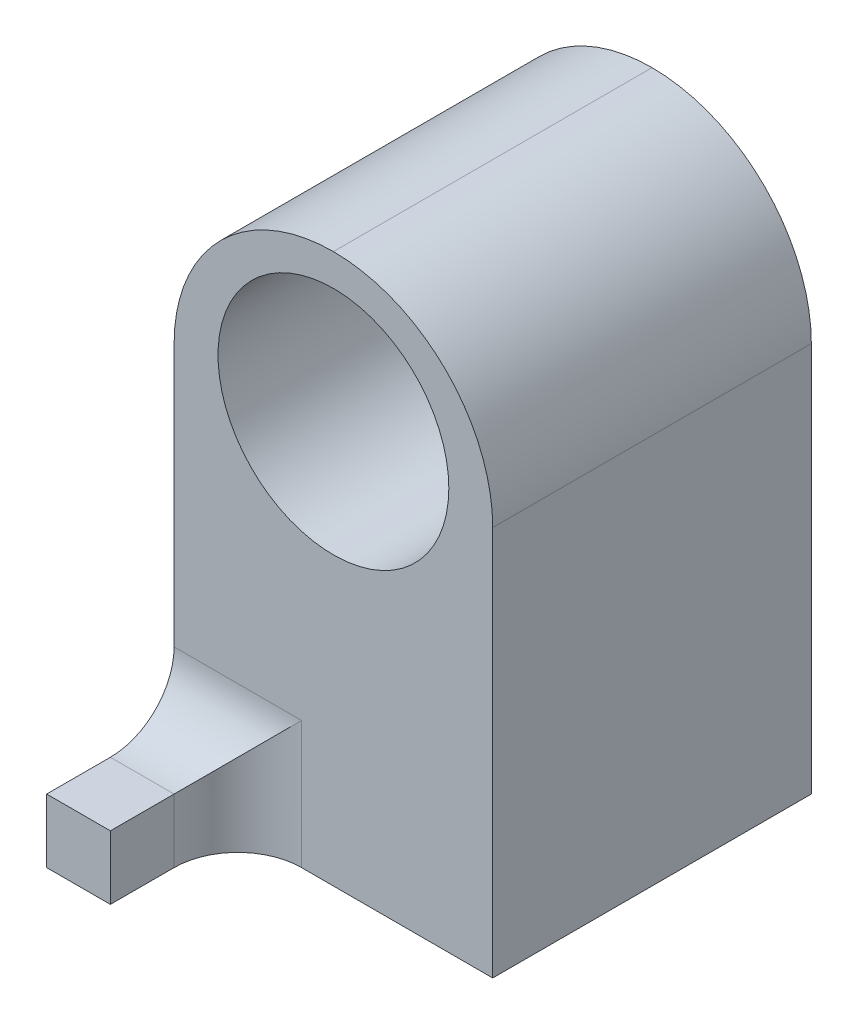
ISO-10303-21;
HEADER;
FILE_DESCRIPTION(('STEP AP214'),'2;1');
FILE_NAME('part.step','',(''),(''),'','','');
FILE_SCHEMA(('AUTOMOTIVE_DESIGN { 1 0 10303 214 1 1 1 1 }'));
ENDSEC;
DATA;
#1=APPLICATION_CONTEXT('core data for automotive mechanical design processes');
#2=APPLICATION_PROTOCOL_DEFINITION('international standard','automotive_design',2000,#1);
#3=PRODUCT_CONTEXT('',#1,'mechanical');
#4=PRODUCT('Part','Part','',(#3));
#5=PRODUCT_RELATED_PRODUCT_CATEGORY('part','',(#4));
#6=PRODUCT_DEFINITION_FORMATION('','',#4);
#7=PRODUCT_DEFINITION_CONTEXT('part definition',#1,'design');
#8=PRODUCT_DEFINITION('design','',#6,#7);
#9=PRODUCT_DEFINITION_SHAPE('','',#8);
#10=(LENGTH_UNIT() NAMED_UNIT(*) SI_UNIT(.MILLI.,.METRE.));
#11=(NAMED_UNIT(*) PLANE_ANGLE_UNIT() SI_UNIT($,.RADIAN.));
#12=(NAMED_UNIT(*) SI_UNIT($,.STERADIAN.) SOLID_ANGLE_UNIT());
#13=UNCERTAINTY_MEASURE_WITH_UNIT(LENGTH_MEASURE(1.E-05),#10,'distance_accuracy_value','');
#14=(GEOMETRIC_REPRESENTATION_CONTEXT(3) GLOBAL_UNCERTAINTY_ASSIGNED_CONTEXT((#13)) GLOBAL_UNIT_ASSIGNED_CONTEXT((#10,
#11,#12)) REPRESENTATION_CONTEXT('',''));
#15=CARTESIAN_POINT('',(0.,0.,0.));
#16=DIRECTION('',(0.,0.,1.));
#17=DIRECTION('',(1.,0.,0.));
#18=AXIS2_PLACEMENT_3D('',#15,#16,#17);
#19=CARTESIAN_POINT('',(-6.35,50.8,6.35));
#20=DIRECTION('',(0.,0.,-1.));
#21=DIRECTION('',(-1.,0.,0.));
#22=AXIS2_PLACEMENT_3D('',#19,#20,#21);
#23=PLANE('',#22);
#24=CARTESIAN_POINT('',(25.4,80.1497,6.35));
#25=DIRECTION('',(0.,0.,1.));
#26=DIRECTION('',(1.,0.,0.));
#27=AXIS2_PLACEMENT_3D('',#24,#25,#26);
#28=CIRCLE('',#27,22.9997);
#29=CARTESIAN_POINT('',(48.3997,80.1497,6.35));
#30=VERTEX_POINT('',#29);
#31=EDGE_CURVE('E193',#30,#30,#28,.T.);
#32=ORIENTED_EDGE('',*,*,#31,.F.);
#33=EDGE_LOOP('',(#32));
#34=FACE_BOUND('',#33,.T.);
#35=DIRECTION('',(0.,-1.,0.));
#36=VECTOR('',#35,1.);
#37=CARTESIAN_POINT('',(-6.35,50.8,6.35));
#38=LINE('',#37,#36);
#39=CARTESIAN_POINT('',(-6.35,77.7494,6.35));
#40=VERTEX_POINT('',#39);
#41=CARTESIAN_POINT('',(-6.35,25.4,6.35));
#42=VERTEX_POINT('',#41);
#43=EDGE_CURVE('E259',#40,#42,#38,.T.);
#44=ORIENTED_EDGE('',*,*,#43,.T.);
#45=DIRECTION('',(-1.,0.,0.));
#46=VECTOR('',#45,1.);
#47=CARTESIAN_POINT('',(6.35,25.4,6.35));
#48=LINE('',#47,#46);
#49=CARTESIAN_POINT('',(19.05,25.4,6.35));
#50=VERTEX_POINT('',#49);
#51=EDGE_CURVE('E62',#42,#50,#48,.F.);
#52=ORIENTED_EDGE('',*,*,#51,.T.);
#53=DIRECTION('',(0.,1.,0.));
#54=VECTOR('',#53,1.);
#55=CARTESIAN_POINT('',(19.05,0.,6.35));
#56=LINE('',#55,#54);
#57=CARTESIAN_POINT('',(19.05,0.,6.35));
#58=VERTEX_POINT('',#57);
#59=EDGE_CURVE('E287',#50,#58,#56,.F.);
#60=ORIENTED_EDGE('',*,*,#59,.T.);
#61=DIRECTION('',(1.,0.,0.));
#62=VECTOR('',#61,1.);
#63=CARTESIAN_POINT('',(-6.35,0.,6.35));
#64=LINE('',#63,#62);
#65=CARTESIAN_POINT('',(57.15,0.,6.35));
#66=VERTEX_POINT('',#65);
#67=EDGE_CURVE('E153',#58,#66,#64,.T.);
#68=ORIENTED_EDGE('',*,*,#67,.T.);
#69=DIRECTION('',(0.,-1.,0.));
#70=VECTOR('',#69,1.);
#71=CARTESIAN_POINT('',(57.15,50.8,6.35));
#72=LINE('',#71,#70);
#73=CARTESIAN_POINT('',(57.15,77.7494,6.35));
#74=VERTEX_POINT('',#73);
#75=EDGE_CURVE('E255',#74,#66,#72,.T.);
#76=ORIENTED_EDGE('',*,*,#75,.F.);
#77=CARTESIAN_POINT('',(25.4,77.7494,6.35));
#78=DIRECTION('',(0.,0.,-1.));
#79=DIRECTION('',(-1.,0.,0.));
#80=AXIS2_PLACEMENT_3D('',#77,#78,#79);
#81=CIRCLE('',#80,31.75);
#82=CARTESIAN_POINT('',(25.4,109.4994,6.35));
#83=VERTEX_POINT('',#82);
#84=EDGE_CURVE('E262',#74,#83,#81,.F.);
#85=ORIENTED_EDGE('',*,*,#84,.T.);
#86=CARTESIAN_POINT('',(25.4,77.7494,6.35));
#87=DIRECTION('',(0.,0.,-1.));
#88=DIRECTION('',(-1.,0.,0.));
#89=AXIS2_PLACEMENT_3D('',#86,#87,#88);
#90=CIRCLE('',#89,31.75);
#91=EDGE_CURVE('E265',#83,#40,#90,.F.);
#92=ORIENTED_EDGE('',*,*,#91,.T.);
#93=EDGE_LOOP('',(#44,#52,#60,#68,#76,#85,#92));
#94=FACE_BOUND('',#93,.T.);
#95=ADVANCED_FACE('F39',(#34,#94),#23,.F.);
#96=CARTESIAN_POINT('',(0.,0.,0.));
#97=DIRECTION('',(0.,-1.,0.));
#98=DIRECTION('',(0.,0.,-1.));
#99=AXIS2_PLACEMENT_3D('',#96,#97,#98);
#100=PLANE('',#99);
#101=DIRECTION('',(0.,0.,1.));
#102=VECTOR('',#101,1.);
#103=CARTESIAN_POINT('',(-6.35,0.,6.35));
#104=LINE('',#103,#102);
#105=CARTESIAN_POINT('',(-6.35,0.,-57.15));
#106=VERTEX_POINT('',#105);
#107=CARTESIAN_POINT('',(-6.35,0.,31.75));
#108=VERTEX_POINT('',#107);
#109=EDGE_CURVE('E140',#106,#108,#104,.T.);
#110=ORIENTED_EDGE('',*,*,#109,.F.);
#111=DIRECTION('',(-1.,0.,0.));
#112=VECTOR('',#111,1.);
#113=CARTESIAN_POINT('',(-6.35,0.,-57.15));
#114=LINE('',#113,#112);
#115=CARTESIAN_POINT('',(57.15,0.,-57.15));
#116=VERTEX_POINT('',#115);
#117=EDGE_CURVE('E247',#116,#106,#114,.T.);
#118=ORIENTED_EDGE('',*,*,#117,.F.);
#119=DIRECTION('',(0.,0.,-1.));
#120=VECTOR('',#119,1.);
#121=CARTESIAN_POINT('',(57.15,0.,6.35));
#122=LINE('',#121,#120);
#123=EDGE_CURVE('E243',#66,#116,#122,.T.);
#124=ORIENTED_EDGE('',*,*,#123,.F.);
#125=ORIENTED_EDGE('',*,*,#67,.F.);
#126=CARTESIAN_POINT('',(19.05,0.,19.05));
#127=DIRECTION('',(0.,-1.,0.));
#128=DIRECTION('',(0.,0.,-1.));
#129=AXIS2_PLACEMENT_3D('',#126,#127,#128);
#130=CIRCLE('',#129,12.7);
#131=CARTESIAN_POINT('',(6.35,0.,19.05));
#132=VERTEX_POINT('',#131);
#133=EDGE_CURVE('E11',#58,#132,#130,.F.);
#134=ORIENTED_EDGE('',*,*,#133,.T.);
#135=DIRECTION('',(0.,0.,-1.));
#136=VECTOR('',#135,1.);
#137=CARTESIAN_POINT('',(6.35,0.,31.75));
#138=LINE('',#137,#136);
#139=CARTESIAN_POINT('',(6.35,0.,31.75));
#140=VERTEX_POINT('',#139);
#141=EDGE_CURVE('E159',#140,#132,#138,.T.);
#142=ORIENTED_EDGE('',*,*,#141,.F.);
#143=DIRECTION('',(1.,0.,0.));
#144=VECTOR('',#143,1.);
#145=CARTESIAN_POINT('',(-6.35,0.,31.75));
#146=LINE('',#145,#144);
#147=EDGE_CURVE('E156',#108,#140,#146,.T.);
#148=ORIENTED_EDGE('',*,*,#147,.F.);
#149=EDGE_LOOP('',(#110,#118,#124,#125,#134,#142,#148));
#150=FACE_BOUND('',#149,.T.);
#151=DIRECTION('',(-1.,0.,0.));
#152=VECTOR('',#151,1.);
#153=CARTESIAN_POINT('',(0.,0.,-50.8));
#154=LINE('',#153,#152);
#155=CARTESIAN_POINT('',(50.8,0.,-50.8));
#156=VERTEX_POINT('',#155);
#157=CARTESIAN_POINT('',(0.,0.,-50.8));
#158=VERTEX_POINT('',#157);
#159=EDGE_CURVE('E202',#156,#158,#154,.T.);
#160=ORIENTED_EDGE('',*,*,#159,.T.);
#161=DIRECTION('',(0.,0.,1.));
#162=VECTOR('',#161,1.);
#163=CARTESIAN_POINT('',(0.,0.,0.));
#164=LINE('',#163,#162);
#165=CARTESIAN_POINT('',(0.,0.,0.));
#166=VERTEX_POINT('',#165);
#167=EDGE_CURVE('E192',#158,#166,#164,.T.);
#168=ORIENTED_EDGE('',*,*,#167,.T.);
#169=DIRECTION('',(1.,0.,0.));
#170=VECTOR('',#169,1.);
#171=CARTESIAN_POINT('',(0.,0.,0.));
#172=LINE('',#171,#170);
#173=CARTESIAN_POINT('',(50.8,0.,0.));
#174=VERTEX_POINT('',#173);
#175=EDGE_CURVE('E218',#166,#174,#172,.T.);
#176=ORIENTED_EDGE('',*,*,#175,.T.);
#177=DIRECTION('',(0.,0.,-1.));
#178=VECTOR('',#177,1.);
#179=CARTESIAN_POINT('',(50.8,0.,0.));
#180=LINE('',#179,#178);
#181=EDGE_CURVE('E222',#174,#156,#180,.T.);
#182=ORIENTED_EDGE('',*,*,#181,.T.);
#183=EDGE_LOOP('',(#160,#168,#176,#182));
#184=FACE_BOUND('',#183,.T.);
#185=ADVANCED_FACE('F157',(#150,#184),#100,.T.);
#186=CARTESIAN_POINT('',(-6.35,50.8,6.35));
#187=DIRECTION('',(1.,0.,0.));
#188=DIRECTION('',(0.,0.,-1.));
#189=AXIS2_PLACEMENT_3D('',#186,#187,#188);
#190=PLANE('',#189);
#191=ORIENTED_EDGE('',*,*,#43,.F.);
#192=DIRECTION('',(0.,0.,1.));
#193=VECTOR('',#192,1.);
#194=CARTESIAN_POINT('',(-6.35,77.7494,6.35));
#195=LINE('',#194,#193);
#196=CARTESIAN_POINT('',(-6.35,77.7494,-57.15));
#197=VERTEX_POINT('',#196);
#198=EDGE_CURVE('E268',#40,#197,#195,.F.);
#199=ORIENTED_EDGE('',*,*,#198,.T.);
#200=DIRECTION('',(0.,-1.,0.));
#201=VECTOR('',#200,1.);
#202=CARTESIAN_POINT('',(-6.35,50.8,-57.15));
#203=LINE('',#202,#201);
#204=EDGE_CURVE('E149',#197,#106,#203,.T.);
#205=ORIENTED_EDGE('',*,*,#204,.T.);
#206=ORIENTED_EDGE('',*,*,#109,.T.);
#207=DIRECTION('',(0.,-1.,0.));
#208=VECTOR('',#207,1.);
#209=CARTESIAN_POINT('',(-6.35,0.,31.75));
#210=LINE('',#209,#208);
#211=CARTESIAN_POINT('',(-6.35,12.7,31.75));
#212=VERTEX_POINT('',#211);
#213=EDGE_CURVE('E146',#212,#108,#210,.T.);
#214=ORIENTED_EDGE('',*,*,#213,.F.);
#215=DIRECTION('',(0.,0.,-1.));
#216=VECTOR('',#215,1.);
#217=CARTESIAN_POINT('',(-6.35,12.7,31.75));
#218=LINE('',#217,#216);
#219=CARTESIAN_POINT('',(-6.35,12.7,19.05));
#220=VERTEX_POINT('',#219);
#221=EDGE_CURVE('E178',#212,#220,#218,.T.);
#222=ORIENTED_EDGE('',*,*,#221,.T.);
#223=CARTESIAN_POINT('',(-6.35,25.4,19.05));
#224=DIRECTION('',(1.,0.,0.));
#225=DIRECTION('',(0.,0.,-1.));
#226=AXIS2_PLACEMENT_3D('',#223,#224,#225);
#227=CIRCLE('',#226,12.7);
#228=EDGE_CURVE('E49',#220,#42,#227,.T.);
#229=ORIENTED_EDGE('',*,*,#228,.T.);
#230=EDGE_LOOP('',(#191,#199,#205,#206,#214,#222,#229));
#231=FACE_BOUND('',#230,.T.);
#232=ADVANCED_FACE('F143',(#231),#190,.F.);
#233=CARTESIAN_POINT('',(57.15,50.8,6.35));
#234=DIRECTION('',(-1.,0.,0.));
#235=DIRECTION('',(0.,0.,1.));
#236=AXIS2_PLACEMENT_3D('',#233,#234,#235);
#237=PLANE('',#236);
#238=DIRECTION('',(0.,-1.,0.));
#239=VECTOR('',#238,1.);
#240=CARTESIAN_POINT('',(57.15,50.8,-57.15));
#241=LINE('',#240,#239);
#242=CARTESIAN_POINT('',(57.15,77.7494,-57.15));
#243=VERTEX_POINT('',#242);
#244=EDGE_CURVE('E252',#243,#116,#241,.T.);
#245=ORIENTED_EDGE('',*,*,#244,.F.);
#246=DIRECTION('',(0.,0.,-1.));
#247=VECTOR('',#246,1.);
#248=CARTESIAN_POINT('',(57.15,77.7494,6.35));
#249=LINE('',#248,#247);
#250=EDGE_CURVE('E277',#243,#74,#249,.F.);
#251=ORIENTED_EDGE('',*,*,#250,.T.);
#252=ORIENTED_EDGE('',*,*,#75,.T.);
#253=ORIENTED_EDGE('',*,*,#123,.T.);
#254=EDGE_LOOP('',(#245,#251,#252,#253));
#255=FACE_BOUND('',#254,.T.);
#256=ADVANCED_FACE('F308',(#255),#237,.F.);
#257=CARTESIAN_POINT('',(-6.35,50.8,-57.15));
#258=DIRECTION('',(0.,0.,1.));
#259=DIRECTION('',(1.,0.,0.));
#260=AXIS2_PLACEMENT_3D('',#257,#258,#259);
#261=PLANE('',#260);
#262=CARTESIAN_POINT('',(25.4,80.1497,-57.15));
#263=DIRECTION('',(0.,0.,1.));
#264=DIRECTION('',(1.,0.,0.));
#265=AXIS2_PLACEMENT_3D('',#262,#263,#264);
#266=CIRCLE('',#265,22.9997);
#267=CARTESIAN_POINT('',(48.3997,80.1497,-57.15));
#268=VERTEX_POINT('',#267);
#269=EDGE_CURVE('E188',#268,#268,#266,.T.);
#270=ORIENTED_EDGE('',*,*,#269,.T.);
#271=EDGE_LOOP('',(#270));
#272=FACE_BOUND('',#271,.T.);
#273=ORIENTED_EDGE('',*,*,#204,.F.);
#274=CARTESIAN_POINT('',(25.4,77.7494,-57.15));
#275=DIRECTION('',(0.,0.,1.));
#276=DIRECTION('',(1.,0.,0.));
#277=AXIS2_PLACEMENT_3D('',#274,#275,#276);
#278=CIRCLE('',#277,31.75);
#279=CARTESIAN_POINT('',(25.4,109.4994,-57.15));
#280=VERTEX_POINT('',#279);
#281=EDGE_CURVE('E274',#197,#280,#278,.F.);
#282=ORIENTED_EDGE('',*,*,#281,.T.);
#283=CARTESIAN_POINT('',(25.4,77.7494,-57.15));
#284=DIRECTION('',(0.,0.,1.));
#285=DIRECTION('',(1.,0.,0.));
#286=AXIS2_PLACEMENT_3D('',#283,#284,#285);
#287=CIRCLE('',#286,31.75);
#288=EDGE_CURVE('E271',#280,#243,#287,.F.);
#289=ORIENTED_EDGE('',*,*,#288,.T.);
#290=ORIENTED_EDGE('',*,*,#244,.T.);
#291=ORIENTED_EDGE('',*,*,#117,.T.);
#292=EDGE_LOOP('',(#273,#282,#289,#290,#291));
#293=FACE_BOUND('',#292,.T.);
#294=ADVANCED_FACE('F318',(#272,#293),#261,.F.);
#295=CARTESIAN_POINT('',(0.,50.8,0.));
#296=DIRECTION('',(1.,0.,0.));
#297=DIRECTION('',(0.,0.,-1.));
#298=AXIS2_PLACEMENT_3D('',#295,#296,#297);
#299=PLANE('',#298);
#300=ORIENTED_EDGE('',*,*,#167,.F.);
#301=DIRECTION('',(0.,-1.,0.));
#302=VECTOR('',#301,1.);
#303=CARTESIAN_POINT('',(0.,50.8,-50.8));
#304=LINE('',#303,#302);
#305=CARTESIAN_POINT('',(0.,50.8,-50.8));
#306=VERTEX_POINT('',#305);
#307=EDGE_CURVE('E214',#306,#158,#304,.T.);
#308=ORIENTED_EDGE('',*,*,#307,.F.);
#309=DIRECTION('',(0.,0.,1.));
#310=VECTOR('',#309,1.);
#311=CARTESIAN_POINT('',(0.,50.8,0.));
#312=LINE('',#311,#310);
#313=CARTESIAN_POINT('',(0.,50.8,0.));
#314=VERTEX_POINT('',#313);
#315=EDGE_CURVE('E197',#306,#314,#312,.T.);
#316=ORIENTED_EDGE('',*,*,#315,.T.);
#317=DIRECTION('',(0.,-1.,0.));
#318=VECTOR('',#317,1.);
#319=CARTESIAN_POINT('',(0.,50.8,0.));
#320=LINE('',#319,#318);
#321=EDGE_CURVE('E154',#314,#166,#320,.T.);
#322=ORIENTED_EDGE('',*,*,#321,.T.);
#323=EDGE_LOOP('',(#300,#308,#316,#322));
#324=FACE_BOUND('',#323,.T.);
#325=ADVANCED_FACE('F320',(#324),#299,.T.);
#326=CARTESIAN_POINT('',(0.,50.8,0.));
#327=DIRECTION('',(0.,0.,-1.));
#328=DIRECTION('',(-1.,0.,0.));
#329=AXIS2_PLACEMENT_3D('',#326,#327,#328);
#330=PLANE('',#329);
#331=ORIENTED_EDGE('',*,*,#175,.F.);
#332=ORIENTED_EDGE('',*,*,#321,.F.);
#333=DIRECTION('',(1.,0.,0.));
#334=VECTOR('',#333,1.);
#335=CARTESIAN_POINT('',(0.,50.8,0.));
#336=LINE('',#335,#334);
#337=CARTESIAN_POINT('',(50.8,50.8,0.));
#338=VERTEX_POINT('',#337);
#339=EDGE_CURVE('E201',#314,#338,#336,.T.);
#340=ORIENTED_EDGE('',*,*,#339,.T.);
#341=DIRECTION('',(0.,-1.,0.));
#342=VECTOR('',#341,1.);
#343=CARTESIAN_POINT('',(50.8,50.8,0.));
#344=LINE('',#343,#342);
#345=EDGE_CURVE('E235',#338,#174,#344,.T.);
#346=ORIENTED_EDGE('',*,*,#345,.T.);
#347=EDGE_LOOP('',(#331,#332,#340,#346));
#348=FACE_BOUND('',#347,.T.);
#349=ADVANCED_FACE('F327',(#348),#330,.T.);
#350=CARTESIAN_POINT('',(50.8,50.8,0.));
#351=DIRECTION('',(-1.,0.,0.));
#352=DIRECTION('',(0.,0.,1.));
#353=AXIS2_PLACEMENT_3D('',#350,#351,#352);
#354=PLANE('',#353);
#355=ORIENTED_EDGE('',*,*,#181,.F.);
#356=ORIENTED_EDGE('',*,*,#345,.F.);
#357=DIRECTION('',(0.,0.,-1.));
#358=VECTOR('',#357,1.);
#359=CARTESIAN_POINT('',(50.8,50.8,0.));
#360=LINE('',#359,#358);
#361=CARTESIAN_POINT('',(50.8,50.8,-50.8));
#362=VERTEX_POINT('',#361);
#363=EDGE_CURVE('E206',#338,#362,#360,.T.);
#364=ORIENTED_EDGE('',*,*,#363,.T.);
#365=DIRECTION('',(0.,-1.,0.));
#366=VECTOR('',#365,1.);
#367=CARTESIAN_POINT('',(50.8,50.8,-50.8));
#368=LINE('',#367,#366);
#369=EDGE_CURVE('E232',#362,#156,#368,.T.);
#370=ORIENTED_EDGE('',*,*,#369,.T.);
#371=EDGE_LOOP('',(#355,#356,#364,#370));
#372=FACE_BOUND('',#371,.T.);
#373=ADVANCED_FACE('F375',(#372),#354,.T.);
#374=CARTESIAN_POINT('',(0.,50.8,-50.8));
#375=DIRECTION('',(0.,0.,1.));
#376=DIRECTION('',(1.,0.,0.));
#377=AXIS2_PLACEMENT_3D('',#374,#375,#376);
#378=PLANE('',#377);
#379=ORIENTED_EDGE('',*,*,#159,.F.);
#380=ORIENTED_EDGE('',*,*,#369,.F.);
#381=DIRECTION('',(-1.,0.,0.));
#382=VECTOR('',#381,1.);
#383=CARTESIAN_POINT('',(0.,50.8,-50.8));
#384=LINE('',#383,#382);
#385=EDGE_CURVE('E210',#362,#306,#384,.T.);
#386=ORIENTED_EDGE('',*,*,#385,.T.);
#387=ORIENTED_EDGE('',*,*,#307,.T.);
#388=EDGE_LOOP('',(#379,#380,#386,#387));
#389=FACE_BOUND('',#388,.T.);
#390=ADVANCED_FACE('F371',(#389),#378,.T.);
#391=CARTESIAN_POINT('',(0.,50.8,0.));
#392=DIRECTION('',(0.,-1.,0.));
#393=DIRECTION('',(0.,0.,-1.));
#394=AXIS2_PLACEMENT_3D('',#391,#392,#393);
#395=PLANE('',#394);
#396=ORIENTED_EDGE('',*,*,#315,.F.);
#397=ORIENTED_EDGE('',*,*,#385,.F.);
#398=ORIENTED_EDGE('',*,*,#363,.F.);
#399=ORIENTED_EDGE('',*,*,#339,.F.);
#400=EDGE_LOOP('',(#396,#397,#398,#399));
#401=FACE_BOUND('',#400,.T.);
#402=ADVANCED_FACE('F367',(#401),#395,.T.);
#403=CARTESIAN_POINT('',(25.4,80.1497,-57.15));
#404=DIRECTION('',(0.,0.,1.));
#405=DIRECTION('',(1.,0.,0.));
#406=AXIS2_PLACEMENT_3D('',#403,#404,#405);
#407=CYLINDRICAL_SURFACE('',#406,22.9997);
#408=ORIENTED_EDGE('',*,*,#269,.F.);
#409=EDGE_LOOP('',(#408));
#410=FACE_BOUND('',#409,.T.);
#411=ORIENTED_EDGE('',*,*,#31,.T.);
#412=EDGE_LOOP('',(#411));
#413=FACE_BOUND('',#412,.T.);
#414=ADVANCED_FACE('F346',(#410,#413),#407,.F.);
#415=CARTESIAN_POINT('',(25.4,77.7494,0.));
#416=DIRECTION('',(0.,0.,-1.));
#417=DIRECTION('',(-1.,0.,0.));
#418=AXIS2_PLACEMENT_3D('',#415,#416,#417);
#419=CYLINDRICAL_SURFACE('',#418,31.75);
#420=ORIENTED_EDGE('',*,*,#250,.F.);
#421=ORIENTED_EDGE('',*,*,#288,.F.);
#422=DIRECTION('',(0.,0.,-1.));
#423=VECTOR('',#422,1.);
#424=CARTESIAN_POINT('',(25.4,109.4994,0.));
#425=LINE('',#424,#423);
#426=EDGE_CURVE('E187',#83,#280,#425,.T.);
#427=ORIENTED_EDGE('',*,*,#426,.F.);
#428=ORIENTED_EDGE('',*,*,#84,.F.);
#429=EDGE_LOOP('',(#420,#421,#427,#428));
#430=FACE_BOUND('',#429,.T.);
#431=ADVANCED_FACE('F313',(#430),#419,.T.);
#432=CARTESIAN_POINT('',(25.4,77.7494,0.));
#433=DIRECTION('',(0.,0.,1.));
#434=DIRECTION('',(1.,0.,0.));
#435=AXIS2_PLACEMENT_3D('',#432,#433,#434);
#436=CYLINDRICAL_SURFACE('',#435,31.75);
#437=ORIENTED_EDGE('',*,*,#281,.F.);
#438=ORIENTED_EDGE('',*,*,#198,.F.);
#439=ORIENTED_EDGE('',*,*,#91,.F.);
#440=ORIENTED_EDGE('',*,*,#426,.T.);
#441=EDGE_LOOP('',(#437,#438,#439,#440));
#442=FACE_BOUND('',#441,.T.);
#443=ADVANCED_FACE('F316',(#442),#436,.T.);
#444=CARTESIAN_POINT('',(6.35,0.,31.75));
#445=DIRECTION('',(-1.,0.,0.));
#446=DIRECTION('',(0.,0.,1.));
#447=AXIS2_PLACEMENT_3D('',#444,#445,#446);
#448=PLANE('',#447);
#449=ORIENTED_EDGE('',*,*,#141,.T.);
#450=DIRECTION('',(0.,1.,0.));
#451=VECTOR('',#450,1.);
#452=CARTESIAN_POINT('',(6.35,12.7,19.05));
#453=LINE('',#452,#451);
#454=CARTESIAN_POINT('',(6.35,12.7,19.05));
#455=VERTEX_POINT('',#454);
#456=EDGE_CURVE('E292',#132,#455,#453,.T.);
#457=ORIENTED_EDGE('',*,*,#456,.T.);
#458=DIRECTION('',(0.,0.,-1.));
#459=VECTOR('',#458,1.);
#460=CARTESIAN_POINT('',(6.35,12.7,31.75));
#461=LINE('',#460,#459);
#462=CARTESIAN_POINT('',(6.35,12.7,31.75));
#463=VERTEX_POINT('',#462);
#464=EDGE_CURVE('E181',#463,#455,#461,.T.);
#465=ORIENTED_EDGE('',*,*,#464,.F.);
#466=DIRECTION('',(0.,1.,0.));
#467=VECTOR('',#466,1.);
#468=CARTESIAN_POINT('',(6.35,0.,31.75));
#469=LINE('',#468,#467);
#470=EDGE_CURVE('E163',#140,#463,#469,.T.);
#471=ORIENTED_EDGE('',*,*,#470,.F.);
#472=EDGE_LOOP('',(#449,#457,#465,#471));
#473=FACE_BOUND('',#472,.T.);
#474=ADVANCED_FACE('F344',(#473),#448,.F.);
#475=CARTESIAN_POINT('',(-6.35,12.7,31.75));
#476=DIRECTION('',(0.,-1.,0.));
#477=DIRECTION('',(0.,0.,-1.));
#478=AXIS2_PLACEMENT_3D('',#475,#476,#477);
#479=PLANE('',#478);
#480=ORIENTED_EDGE('',*,*,#464,.T.);
#481=DIRECTION('',(-1.,0.,0.));
#482=VECTOR('',#481,1.);
#483=CARTESIAN_POINT('',(-6.35,12.7,19.05));
#484=LINE('',#483,#482);
#485=EDGE_CURVE('E280',#455,#220,#484,.T.);
#486=ORIENTED_EDGE('',*,*,#485,.T.);
#487=ORIENTED_EDGE('',*,*,#221,.F.);
#488=DIRECTION('',(-1.,0.,0.));
#489=VECTOR('',#488,1.);
#490=CARTESIAN_POINT('',(-6.35,12.7,31.75));
#491=LINE('',#490,#489);
#492=EDGE_CURVE('E167',#463,#212,#491,.T.);
#493=ORIENTED_EDGE('',*,*,#492,.F.);
#494=EDGE_LOOP('',(#480,#486,#487,#493));
#495=FACE_BOUND('',#494,.T.);
#496=ADVANCED_FACE('F354',(#495),#479,.F.);
#497=CARTESIAN_POINT('',(0.,0.,31.75));
#498=DIRECTION('',(0.,0.,-1.));
#499=DIRECTION('',(-1.,0.,0.));
#500=AXIS2_PLACEMENT_3D('',#497,#498,#499);
#501=PLANE('',#500);
#502=ORIENTED_EDGE('',*,*,#213,.T.);
#503=ORIENTED_EDGE('',*,*,#147,.T.);
#504=ORIENTED_EDGE('',*,*,#470,.T.);
#505=ORIENTED_EDGE('',*,*,#492,.T.);
#506=EDGE_LOOP('',(#502,#503,#504,#505));
#507=FACE_BOUND('',#506,.T.);
#508=ADVANCED_FACE('F165',(#507),#501,.F.);
#509=CARTESIAN_POINT('',(19.05,0.,19.05));
#510=DIRECTION('',(0.,-1.,0.));
#511=DIRECTION('',(0.,0.,-1.));
#512=AXIS2_PLACEMENT_3D('',#509,#510,#511);
#513=CYLINDRICAL_SURFACE('',#512,12.7);
#514=ORIENTED_EDGE('',*,*,#133,.F.);
#515=ORIENTED_EDGE('',*,*,#59,.F.);
#516=CARTESIAN_POINT('',(19.05,25.4,19.05));
#517=DIRECTION('',(0.707106781186547,-0.707106781186547,0.));
#518=DIRECTION('',(-0.707106781186547,-0.707106781186547,0.));
#519=AXIS2_PLACEMENT_3D('',#516,#517,#518);
#520=ELLIPSE('',#519,17.9605122421383,12.7);
#521=EDGE_CURVE('E43',#455,#50,#520,.T.);
#522=ORIENTED_EDGE('',*,*,#521,.F.);
#523=ORIENTED_EDGE('',*,*,#456,.F.);
#524=EDGE_LOOP('',(#514,#515,#522,#523));
#525=FACE_BOUND('',#524,.T.);
#526=ADVANCED_FACE('F41',(#525),#513,.F.);
#527=CARTESIAN_POINT('',(-6.35,25.4,19.05));
#528=DIRECTION('',(1.,0.,0.));
#529=DIRECTION('',(0.,0.,-1.));
#530=AXIS2_PLACEMENT_3D('',#527,#528,#529);
#531=CYLINDRICAL_SURFACE('',#530,12.7);
#532=ORIENTED_EDGE('',*,*,#521,.T.);
#533=ORIENTED_EDGE('',*,*,#51,.F.);
#534=ORIENTED_EDGE('',*,*,#228,.F.);
#535=ORIENTED_EDGE('',*,*,#485,.F.);
#536=EDGE_LOOP('',(#532,#533,#534,#535));
#537=FACE_BOUND('',#536,.T.);
#538=ADVANCED_FACE('F300',(#537),#531,.F.);
#539=CLOSED_SHELL('',(#95,#185,#232,#256,#294,#325,#349,#373,#390,#402,#414,#431,#443,#474,#496,
#508,#526,#538));
#540=MANIFOLD_SOLID_BREP('B2',#539);
#541=ADVANCED_BREP_SHAPE_REPRESENTATION('',(#18,#540),#14);
#542=SHAPE_DEFINITION_REPRESENTATION(#9,#541);
ENDSEC;
END-ISO-10303-21;
